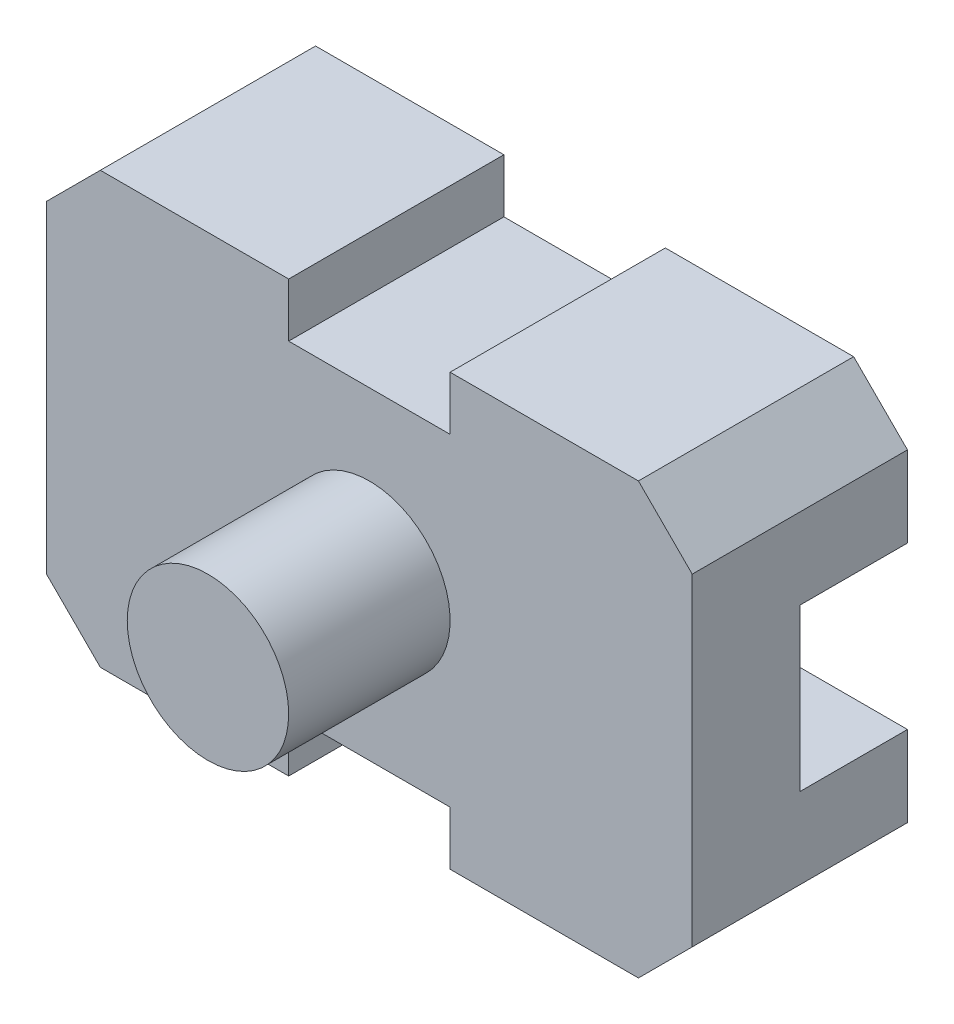
ISO-10303-21;
HEADER;
FILE_DESCRIPTION(('STEP AP214'),'2;1');
FILE_NAME('part.step','',(''),(''),'','','');
FILE_SCHEMA(('AUTOMOTIVE_DESIGN { 1 0 10303 214 1 1 1 1 }'));
ENDSEC;
DATA;
#1=APPLICATION_CONTEXT('core data for automotive mechanical design processes');
#2=APPLICATION_PROTOCOL_DEFINITION('international standard','automotive_design',2000,#1);
#3=PRODUCT_CONTEXT('',#1,'mechanical');
#4=PRODUCT('Part','Part','',(#3));
#5=PRODUCT_RELATED_PRODUCT_CATEGORY('part','',(#4));
#6=PRODUCT_DEFINITION_FORMATION('','',#4);
#7=PRODUCT_DEFINITION_CONTEXT('part definition',#1,'design');
#8=PRODUCT_DEFINITION('design','',#6,#7);
#9=PRODUCT_DEFINITION_SHAPE('','',#8);
#10=(LENGTH_UNIT() NAMED_UNIT(*) SI_UNIT(.MILLI.,.METRE.));
#11=(NAMED_UNIT(*) PLANE_ANGLE_UNIT() SI_UNIT($,.RADIAN.));
#12=(NAMED_UNIT(*) SI_UNIT($,.STERADIAN.) SOLID_ANGLE_UNIT());
#13=UNCERTAINTY_MEASURE_WITH_UNIT(LENGTH_MEASURE(1.E-05),#10,'distance_accuracy_value','');
#14=(GEOMETRIC_REPRESENTATION_CONTEXT(3) GLOBAL_UNCERTAINTY_ASSIGNED_CONTEXT((#13)) GLOBAL_UNIT_ASSIGNED_CONTEXT((#10,
#11,#12)) REPRESENTATION_CONTEXT('',''));
#15=CARTESIAN_POINT('',(0.,0.,0.));
#16=DIRECTION('',(0.,0.,1.));
#17=DIRECTION('',(1.,0.,0.));
#18=AXIS2_PLACEMENT_3D('',#15,#16,#17);
#19=CARTESIAN_POINT('',(0.,0.,0.));
#20=DIRECTION('',(0.,0.,-1.));
#21=DIRECTION('',(-1.,0.,0.));
#22=AXIS2_PLACEMENT_3D('',#19,#20,#21);
#23=PLANE('',#22);
#24=DIRECTION('',(-1.,0.,0.));
#25=VECTOR('',#24,1.);
#26=CARTESIAN_POINT('',(-30.,20.,0.));
#27=LINE('',#26,#25);
#28=CARTESIAN_POINT('',(25.,20.,0.));
#29=VERTEX_POINT('',#28);
#30=CARTESIAN_POINT('',(7.50000000000001,20.,0.));
#31=VERTEX_POINT('',#30);
#32=EDGE_CURVE('E290',#29,#31,#27,.T.);
#33=ORIENTED_EDGE('',*,*,#32,.F.);
#34=DIRECTION('',(-0.707106781186546,0.707106781186549,0.));
#35=VECTOR('',#34,1.);
#36=CARTESIAN_POINT('',(22.5,22.5,0.));
#37=LINE('',#36,#35);
#38=CARTESIAN_POINT('',(30.,15.,0.));
#39=VERTEX_POINT('',#38);
#40=EDGE_CURVE('E319',#29,#39,#37,.F.);
#41=ORIENTED_EDGE('',*,*,#40,.T.);
#42=DIRECTION('',(0.,1.,0.));
#43=VECTOR('',#42,1.);
#44=CARTESIAN_POINT('',(30.,-20.,0.));
#45=LINE('',#44,#43);
#46=CARTESIAN_POINT('',(30.,7.5,0.));
#47=VERTEX_POINT('',#46);
#48=EDGE_CURVE('E195',#47,#39,#45,.T.);
#49=ORIENTED_EDGE('',*,*,#48,.F.);
#50=DIRECTION('',(-1.,0.,0.));
#51=VECTOR('',#50,1.);
#52=CARTESIAN_POINT('',(30.,7.5,0.));
#53=LINE('',#52,#51);
#54=CARTESIAN_POINT('',(-30.,7.5,0.));
#55=VERTEX_POINT('',#54);
#56=EDGE_CURVE('E232',#47,#55,#53,.T.);
#57=ORIENTED_EDGE('',*,*,#56,.T.);
#58=DIRECTION('',(0.,-1.,0.));
#59=VECTOR('',#58,1.);
#60=CARTESIAN_POINT('',(-30.,-20.,0.));
#61=LINE('',#60,#59);
#62=CARTESIAN_POINT('',(-30.,15.,0.));
#63=VERTEX_POINT('',#62);
#64=EDGE_CURVE('E292',#63,#55,#61,.T.);
#65=ORIENTED_EDGE('',*,*,#64,.F.);
#66=DIRECTION('',(-0.707106781186549,-0.707106781186547,0.));
#67=VECTOR('',#66,1.);
#68=CARTESIAN_POINT('',(-22.5,22.5,0.));
#69=LINE('',#68,#67);
#70=CARTESIAN_POINT('',(-25.,20.,0.));
#71=VERTEX_POINT('',#70);
#72=EDGE_CURVE('E60',#63,#71,#69,.F.);
#73=ORIENTED_EDGE('',*,*,#72,.T.);
#74=CARTESIAN_POINT('',(-7.49999999999999,20.,0.));
#75=VERTEX_POINT('',#74);
#76=EDGE_CURVE('E194',#75,#71,#27,.T.);
#77=ORIENTED_EDGE('',*,*,#76,.F.);
#78=DIRECTION('',(0.,1.,0.));
#79=VECTOR('',#78,1.);
#80=CARTESIAN_POINT('',(-7.49999999999999,15.,0.));
#81=LINE('',#80,#79);
#82=CARTESIAN_POINT('',(-7.49999999999999,15.,0.));
#83=VERTEX_POINT('',#82);
#84=EDGE_CURVE('E221',#83,#75,#81,.T.);
#85=ORIENTED_EDGE('',*,*,#84,.F.);
#86=DIRECTION('',(-1.,0.,0.));
#87=VECTOR('',#86,1.);
#88=CARTESIAN_POINT('',(-7.49999999999999,15.,0.));
#89=LINE('',#88,#87);
#90=CARTESIAN_POINT('',(7.50000000000001,15.,0.));
#91=VERTEX_POINT('',#90);
#92=EDGE_CURVE('E224',#91,#83,#89,.T.);
#93=ORIENTED_EDGE('',*,*,#92,.F.);
#94=DIRECTION('',(0.,-1.,0.));
#95=VECTOR('',#94,1.);
#96=CARTESIAN_POINT('',(7.50000000000001,15.,0.));
#97=LINE('',#96,#95);
#98=EDGE_CURVE('E219',#31,#91,#97,.T.);
#99=ORIENTED_EDGE('',*,*,#98,.F.);
#100=EDGE_LOOP('',(#33,#41,#49,#57,#65,#73,#77,#85,#93,#99));
#101=FACE_BOUND('',#100,.T.);
#102=ADVANCED_FACE('F45',(#101),#23,.T.);
#103=CARTESIAN_POINT('',(0.,0.,20.));
#104=DIRECTION('',(0.,0.,-1.));
#105=DIRECTION('',(-1.,0.,0.));
#106=AXIS2_PLACEMENT_3D('',#103,#104,#105);
#107=PLANE('',#106);
#108=CARTESIAN_POINT('',(0.,0.,20.));
#109=DIRECTION('',(0.,0.,-1.));
#110=DIRECTION('',(-1.,0.,0.));
#111=AXIS2_PLACEMENT_3D('',#108,#109,#110);
#112=CIRCLE('',#111,7.5);
#113=CARTESIAN_POINT('',(-7.5,0.,20.));
#114=VERTEX_POINT('',#113);
#115=EDGE_CURVE('E288',#114,#114,#112,.F.);
#116=ORIENTED_EDGE('',*,*,#115,.F.);
#117=EDGE_LOOP('',(#116));
#118=FACE_BOUND('',#117,.T.);
#119=DIRECTION('',(1.,0.,0.));
#120=VECTOR('',#119,1.);
#121=CARTESIAN_POINT('',(-30.,-20.,20.));
#122=LINE('',#121,#120);
#123=CARTESIAN_POINT('',(7.50000000000001,-20.,20.));
#124=VERTEX_POINT('',#123);
#125=CARTESIAN_POINT('',(25.,-20.,20.));
#126=VERTEX_POINT('',#125);
#127=EDGE_CURVE('E286',#124,#126,#122,.T.);
#128=ORIENTED_EDGE('',*,*,#127,.T.);
#129=DIRECTION('',(-0.707106781186549,-0.707106781186547,0.));
#130=VECTOR('',#129,1.);
#131=CARTESIAN_POINT('',(30.,-15.,20.));
#132=LINE('',#131,#130);
#133=CARTESIAN_POINT('',(30.,-15.,20.));
#134=VERTEX_POINT('',#133);
#135=EDGE_CURVE('E313',#126,#134,#132,.F.);
#136=ORIENTED_EDGE('',*,*,#135,.T.);
#137=DIRECTION('',(0.,1.,0.));
#138=VECTOR('',#137,1.);
#139=CARTESIAN_POINT('',(30.,-20.,20.));
#140=LINE('',#139,#138);
#141=CARTESIAN_POINT('',(30.,15.,20.));
#142=VERTEX_POINT('',#141);
#143=EDGE_CURVE('E276',#134,#142,#140,.T.);
#144=ORIENTED_EDGE('',*,*,#143,.T.);
#145=DIRECTION('',(0.707106781186546,-0.707106781186549,0.));
#146=VECTOR('',#145,1.);
#147=CARTESIAN_POINT('',(25.,20.,20.));
#148=LINE('',#147,#146);
#149=CARTESIAN_POINT('',(25.,20.,20.));
#150=VERTEX_POINT('',#149);
#151=EDGE_CURVE('E311',#142,#150,#148,.F.);
#152=ORIENTED_EDGE('',*,*,#151,.T.);
#153=DIRECTION('',(-1.,0.,0.));
#154=VECTOR('',#153,1.);
#155=CARTESIAN_POINT('',(-30.,20.,20.));
#156=LINE('',#155,#154);
#157=CARTESIAN_POINT('',(7.50000000000001,20.,20.));
#158=VERTEX_POINT('',#157);
#159=EDGE_CURVE('E281',#150,#158,#156,.T.);
#160=ORIENTED_EDGE('',*,*,#159,.T.);
#161=DIRECTION('',(0.,-1.,0.));
#162=VECTOR('',#161,1.);
#163=CARTESIAN_POINT('',(7.50000000000001,15.,20.));
#164=LINE('',#163,#162);
#165=CARTESIAN_POINT('',(7.50000000000001,15.,20.));
#166=VERTEX_POINT('',#165);
#167=EDGE_CURVE('E228',#158,#166,#164,.T.);
#168=ORIENTED_EDGE('',*,*,#167,.T.);
#169=DIRECTION('',(-1.,0.,0.));
#170=VECTOR('',#169,1.);
#171=CARTESIAN_POINT('',(-7.49999999999999,15.,20.));
#172=LINE('',#171,#170);
#173=CARTESIAN_POINT('',(-7.49999999999999,15.,20.));
#174=VERTEX_POINT('',#173);
#175=EDGE_CURVE('E222',#166,#174,#172,.T.);
#176=ORIENTED_EDGE('',*,*,#175,.T.);
#177=DIRECTION('',(0.,1.,0.));
#178=VECTOR('',#177,1.);
#179=CARTESIAN_POINT('',(-7.49999999999999,15.,20.));
#180=LINE('',#179,#178);
#181=CARTESIAN_POINT('',(-7.49999999999999,20.,20.));
#182=VERTEX_POINT('',#181);
#183=EDGE_CURVE('E231',#174,#182,#180,.T.);
#184=ORIENTED_EDGE('',*,*,#183,.T.);
#185=CARTESIAN_POINT('',(-25.,20.,20.));
#186=VERTEX_POINT('',#185);
#187=EDGE_CURVE('E279',#182,#186,#156,.T.);
#188=ORIENTED_EDGE('',*,*,#187,.T.);
#189=DIRECTION('',(0.707106781186549,0.707106781186547,0.));
#190=VECTOR('',#189,1.);
#191=CARTESIAN_POINT('',(-30.,15.,20.));
#192=LINE('',#191,#190);
#193=CARTESIAN_POINT('',(-30.,15.,20.));
#194=VERTEX_POINT('',#193);
#195=EDGE_CURVE('E309',#186,#194,#192,.F.);
#196=ORIENTED_EDGE('',*,*,#195,.T.);
#197=DIRECTION('',(0.,-1.,0.));
#198=VECTOR('',#197,1.);
#199=CARTESIAN_POINT('',(-30.,-20.,20.));
#200=LINE('',#199,#198);
#201=CARTESIAN_POINT('',(-30.,-15.,20.));
#202=VERTEX_POINT('',#201);
#203=EDGE_CURVE('E283',#194,#202,#200,.T.);
#204=ORIENTED_EDGE('',*,*,#203,.T.);
#205=DIRECTION('',(-0.707106781186546,0.707106781186549,0.));
#206=VECTOR('',#205,1.);
#207=CARTESIAN_POINT('',(-25.,-20.,20.));
#208=LINE('',#207,#206);
#209=CARTESIAN_POINT('',(-25.,-20.,20.));
#210=VERTEX_POINT('',#209);
#211=EDGE_CURVE('E307',#202,#210,#208,.F.);
#212=ORIENTED_EDGE('',*,*,#211,.T.);
#213=CARTESIAN_POINT('',(-7.49999999999999,-20.,20.));
#214=VERTEX_POINT('',#213);
#215=EDGE_CURVE('E287',#210,#214,#122,.T.);
#216=ORIENTED_EDGE('',*,*,#215,.T.);
#217=DIRECTION('',(0.,-1.,0.));
#218=VECTOR('',#217,1.);
#219=CARTESIAN_POINT('',(-7.49999999999999,-15.,20.));
#220=LINE('',#219,#218);
#221=CARTESIAN_POINT('',(-7.49999999999999,-15.,20.));
#222=VERTEX_POINT('',#221);
#223=EDGE_CURVE('E251',#222,#214,#220,.T.);
#224=ORIENTED_EDGE('',*,*,#223,.F.);
#225=DIRECTION('',(-1.,0.,0.));
#226=VECTOR('',#225,1.);
#227=CARTESIAN_POINT('',(-7.49999999999999,-15.,20.));
#228=LINE('',#227,#226);
#229=CARTESIAN_POINT('',(7.50000000000001,-15.,20.));
#230=VERTEX_POINT('',#229);
#231=EDGE_CURVE('E260',#230,#222,#228,.T.);
#232=ORIENTED_EDGE('',*,*,#231,.F.);
#233=DIRECTION('',(0.,1.,0.));
#234=VECTOR('',#233,1.);
#235=CARTESIAN_POINT('',(7.50000000000001,-15.,20.));
#236=LINE('',#235,#234);
#237=EDGE_CURVE('E240',#124,#230,#236,.T.);
#238=ORIENTED_EDGE('',*,*,#237,.F.);
#239=EDGE_LOOP('',(#128,#136,#144,#152,#160,#168,#176,#184,#188,#196,#204,#212,#216,#224,#232,#238));
#240=FACE_BOUND('',#239,.T.);
#241=ADVANCED_FACE('F332',(#118,#240),#107,.F.);
#242=CARTESIAN_POINT('',(-30.,20.,20.));
#243=DIRECTION('',(0.,-1.,0.));
#244=DIRECTION('',(0.,0.,-1.));
#245=AXIS2_PLACEMENT_3D('',#242,#243,#244);
#246=PLANE('',#245);
#247=ORIENTED_EDGE('',*,*,#159,.F.);
#248=DIRECTION('',(0.,0.,-1.));
#249=VECTOR('',#248,1.);
#250=CARTESIAN_POINT('',(25.,20.,20.));
#251=LINE('',#250,#249);
#252=EDGE_CURVE('E315',#150,#29,#251,.T.);
#253=ORIENTED_EDGE('',*,*,#252,.T.);
#254=ORIENTED_EDGE('',*,*,#32,.T.);
#255=DIRECTION('',(0.,0.,1.));
#256=VECTOR('',#255,1.);
#257=CARTESIAN_POINT('',(7.50000000000001,20.,0.));
#258=LINE('',#257,#256);
#259=EDGE_CURVE('E227',#31,#158,#258,.T.);
#260=ORIENTED_EDGE('',*,*,#259,.T.);
#261=EDGE_LOOP('',(#247,#253,#254,#260));
#262=FACE_BOUND('',#261,.T.);
#263=ADVANCED_FACE('F374',(#262),#246,.F.);
#264=ORIENTED_EDGE('',*,*,#76,.T.);
#265=DIRECTION('',(0.,0.,1.));
#266=VECTOR('',#265,1.);
#267=CARTESIAN_POINT('',(-25.,20.,20.));
#268=LINE('',#267,#266);
#269=EDGE_CURVE('E53',#71,#186,#268,.T.);
#270=ORIENTED_EDGE('',*,*,#269,.T.);
#271=ORIENTED_EDGE('',*,*,#187,.F.);
#272=DIRECTION('',(0.,0.,1.));
#273=VECTOR('',#272,1.);
#274=CARTESIAN_POINT('',(-7.49999999999999,20.,0.));
#275=LINE('',#274,#273);
#276=EDGE_CURVE('E243',#75,#182,#275,.T.);
#277=ORIENTED_EDGE('',*,*,#276,.F.);
#278=EDGE_LOOP('',(#264,#270,#271,#277));
#279=FACE_BOUND('',#278,.T.);
#280=ADVANCED_FACE('F327',(#279),#246,.F.);
#281=CARTESIAN_POINT('',(30.,-15.,0.));
#282=VERTEX_POINT('',#281);
#283=CARTESIAN_POINT('',(30.,-7.5,0.));
#284=VERTEX_POINT('',#283);
#285=EDGE_CURVE('E184',#282,#284,#45,.T.);
#286=ORIENTED_EDGE('',*,*,#285,.F.);
#287=DIRECTION('',(0.707106781186549,0.707106781186547,0.));
#288=VECTOR('',#287,1.);
#289=CARTESIAN_POINT('',(22.5,-22.5,0.));
#290=LINE('',#289,#288);
#291=CARTESIAN_POINT('',(25.,-20.,0.));
#292=VERTEX_POINT('',#291);
#293=EDGE_CURVE('E303',#282,#292,#290,.F.);
#294=ORIENTED_EDGE('',*,*,#293,.T.);
#295=DIRECTION('',(1.,0.,0.));
#296=VECTOR('',#295,1.);
#297=CARTESIAN_POINT('',(-30.,-20.,0.));
#298=LINE('',#297,#296);
#299=CARTESIAN_POINT('',(7.50000000000001,-20.,0.));
#300=VERTEX_POINT('',#299);
#301=EDGE_CURVE('E294',#300,#292,#298,.T.);
#302=ORIENTED_EDGE('',*,*,#301,.F.);
#303=DIRECTION('',(0.,1.,0.));
#304=VECTOR('',#303,1.);
#305=CARTESIAN_POINT('',(7.50000000000001,-15.,0.));
#306=LINE('',#305,#304);
#307=CARTESIAN_POINT('',(7.50000000000001,-15.,0.));
#308=VERTEX_POINT('',#307);
#309=EDGE_CURVE('E247',#300,#308,#306,.T.);
#310=ORIENTED_EDGE('',*,*,#309,.T.);
#311=DIRECTION('',(-1.,0.,0.));
#312=VECTOR('',#311,1.);
#313=CARTESIAN_POINT('',(-7.49999999999999,-15.,0.));
#314=LINE('',#313,#312);
#315=CARTESIAN_POINT('',(-7.49999999999999,-15.,0.));
#316=VERTEX_POINT('',#315);
#317=EDGE_CURVE('E250',#308,#316,#314,.T.);
#318=ORIENTED_EDGE('',*,*,#317,.T.);
#319=DIRECTION('',(0.,-1.,0.));
#320=VECTOR('',#319,1.);
#321=CARTESIAN_POINT('',(-7.49999999999999,-15.,0.));
#322=LINE('',#321,#320);
#323=CARTESIAN_POINT('',(-7.49999999999999,-20.,0.));
#324=VERTEX_POINT('',#323);
#325=EDGE_CURVE('E254',#316,#324,#322,.T.);
#326=ORIENTED_EDGE('',*,*,#325,.T.);
#327=CARTESIAN_POINT('',(-25.,-20.,0.));
#328=VERTEX_POINT('',#327);
#329=EDGE_CURVE('E280',#328,#324,#298,.T.);
#330=ORIENTED_EDGE('',*,*,#329,.F.);
#331=DIRECTION('',(0.707106781186546,-0.707106781186549,0.));
#332=VECTOR('',#331,1.);
#333=CARTESIAN_POINT('',(-22.5,-22.5,0.));
#334=LINE('',#333,#332);
#335=CARTESIAN_POINT('',(-30.,-15.,0.));
#336=VERTEX_POINT('',#335);
#337=EDGE_CURVE('E301',#328,#336,#334,.F.);
#338=ORIENTED_EDGE('',*,*,#337,.T.);
#339=CARTESIAN_POINT('',(-30.,-7.5,0.));
#340=VERTEX_POINT('',#339);
#341=EDGE_CURVE('E210',#340,#336,#61,.T.);
#342=ORIENTED_EDGE('',*,*,#341,.F.);
#343=DIRECTION('',(-1.,0.,0.));
#344=VECTOR('',#343,1.);
#345=CARTESIAN_POINT('',(30.,-7.5,0.));
#346=LINE('',#345,#344);
#347=EDGE_CURVE('E200',#284,#340,#346,.T.);
#348=ORIENTED_EDGE('',*,*,#347,.F.);
#349=EDGE_LOOP('',(#286,#294,#302,#310,#318,#326,#330,#338,#342,#348));
#350=FACE_BOUND('',#349,.T.);
#351=ADVANCED_FACE('F208',(#350),#23,.T.);
#352=CARTESIAN_POINT('',(-30.,-20.,20.));
#353=DIRECTION('',(0.,1.,0.));
#354=DIRECTION('',(0.,0.,1.));
#355=AXIS2_PLACEMENT_3D('',#352,#353,#354);
#356=PLANE('',#355);
#357=ORIENTED_EDGE('',*,*,#301,.T.);
#358=DIRECTION('',(0.,0.,1.));
#359=VECTOR('',#358,1.);
#360=CARTESIAN_POINT('',(25.,-20.,20.));
#361=LINE('',#360,#359);
#362=EDGE_CURVE('E305',#292,#126,#361,.T.);
#363=ORIENTED_EDGE('',*,*,#362,.T.);
#364=ORIENTED_EDGE('',*,*,#127,.F.);
#365=DIRECTION('',(0.,0.,1.));
#366=VECTOR('',#365,1.);
#367=CARTESIAN_POINT('',(7.50000000000001,-20.,0.));
#368=LINE('',#367,#366);
#369=EDGE_CURVE('E265',#300,#124,#368,.T.);
#370=ORIENTED_EDGE('',*,*,#369,.F.);
#371=EDGE_LOOP('',(#357,#363,#364,#370));
#372=FACE_BOUND('',#371,.T.);
#373=ADVANCED_FACE('F379',(#372),#356,.F.);
#374=CARTESIAN_POINT('',(30.,-20.,20.));
#375=DIRECTION('',(-1.,0.,0.));
#376=DIRECTION('',(0.,0.,1.));
#377=AXIS2_PLACEMENT_3D('',#374,#375,#376);
#378=PLANE('',#377);
#379=ORIENTED_EDGE('',*,*,#143,.F.);
#380=DIRECTION('',(0.,0.,-1.));
#381=VECTOR('',#380,1.);
#382=CARTESIAN_POINT('',(30.,-15.,20.));
#383=LINE('',#382,#381);
#384=EDGE_CURVE('E191',#134,#282,#383,.T.);
#385=ORIENTED_EDGE('',*,*,#384,.T.);
#386=ORIENTED_EDGE('',*,*,#285,.T.);
#387=DIRECTION('',(0.,0.,1.));
#388=VECTOR('',#387,1.);
#389=CARTESIAN_POINT('',(30.,-7.5,10.));
#390=LINE('',#389,#388);
#391=CARTESIAN_POINT('',(30.,-7.5,10.));
#392=VERTEX_POINT('',#391);
#393=EDGE_CURVE('E189',#284,#392,#390,.T.);
#394=ORIENTED_EDGE('',*,*,#393,.T.);
#395=DIRECTION('',(0.,1.,0.));
#396=VECTOR('',#395,1.);
#397=CARTESIAN_POINT('',(30.,-7.5,10.));
#398=LINE('',#397,#396);
#399=CARTESIAN_POINT('',(30.,7.5,10.));
#400=VERTEX_POINT('',#399);
#401=EDGE_CURVE('E204',#392,#400,#398,.T.);
#402=ORIENTED_EDGE('',*,*,#401,.T.);
#403=DIRECTION('',(0.,0.,-1.));
#404=VECTOR('',#403,1.);
#405=CARTESIAN_POINT('',(30.,7.5,10.));
#406=LINE('',#405,#404);
#407=EDGE_CURVE('E211',#400,#47,#406,.T.);
#408=ORIENTED_EDGE('',*,*,#407,.T.);
#409=ORIENTED_EDGE('',*,*,#48,.T.);
#410=DIRECTION('',(0.,0.,1.));
#411=VECTOR('',#410,1.);
#412=CARTESIAN_POINT('',(30.,15.,20.));
#413=LINE('',#412,#411);
#414=EDGE_CURVE('E298',#39,#142,#413,.T.);
#415=ORIENTED_EDGE('',*,*,#414,.T.);
#416=EDGE_LOOP('',(#379,#385,#386,#394,#402,#408,#409,#415));
#417=FACE_BOUND('',#416,.T.);
#418=ADVANCED_FACE('F187',(#417),#378,.F.);
#419=CARTESIAN_POINT('',(-30.,-20.,20.));
#420=DIRECTION('',(1.,0.,0.));
#421=DIRECTION('',(0.,0.,-1.));
#422=AXIS2_PLACEMENT_3D('',#419,#420,#421);
#423=PLANE('',#422);
#424=ORIENTED_EDGE('',*,*,#203,.F.);
#425=DIRECTION('',(0.,0.,-1.));
#426=VECTOR('',#425,1.);
#427=CARTESIAN_POINT('',(-30.,15.,20.));
#428=LINE('',#427,#426);
#429=EDGE_CURVE('E323',#194,#63,#428,.T.);
#430=ORIENTED_EDGE('',*,*,#429,.T.);
#431=ORIENTED_EDGE('',*,*,#64,.T.);
#432=DIRECTION('',(0.,0.,-1.));
#433=VECTOR('',#432,1.);
#434=CARTESIAN_POINT('',(-30.,7.5,10.));
#435=LINE('',#434,#433);
#436=CARTESIAN_POINT('',(-30.,7.5,10.));
#437=VERTEX_POINT('',#436);
#438=EDGE_CURVE('E205',#437,#55,#435,.T.);
#439=ORIENTED_EDGE('',*,*,#438,.F.);
#440=DIRECTION('',(0.,1.,0.));
#441=VECTOR('',#440,1.);
#442=CARTESIAN_POINT('',(-30.,-7.5,10.));
#443=LINE('',#442,#441);
#444=CARTESIAN_POINT('',(-30.,-7.5,10.));
#445=VERTEX_POINT('',#444);
#446=EDGE_CURVE('E349',#445,#437,#443,.T.);
#447=ORIENTED_EDGE('',*,*,#446,.F.);
#448=DIRECTION('',(0.,0.,1.));
#449=VECTOR('',#448,1.);
#450=CARTESIAN_POINT('',(-30.,-7.5,10.));
#451=LINE('',#450,#449);
#452=EDGE_CURVE('E352',#340,#445,#451,.T.);
#453=ORIENTED_EDGE('',*,*,#452,.F.);
#454=ORIENTED_EDGE('',*,*,#341,.T.);
#455=DIRECTION('',(0.,0.,1.));
#456=VECTOR('',#455,1.);
#457=CARTESIAN_POINT('',(-30.,-15.,20.));
#458=LINE('',#457,#456);
#459=EDGE_CURVE('E321',#336,#202,#458,.T.);
#460=ORIENTED_EDGE('',*,*,#459,.T.);
#461=EDGE_LOOP('',(#424,#430,#431,#439,#447,#453,#454,#460));
#462=FACE_BOUND('',#461,.T.);
#463=ADVANCED_FACE('F337',(#462),#423,.F.);
#464=ORIENTED_EDGE('',*,*,#215,.F.);
#465=DIRECTION('',(0.,0.,-1.));
#466=VECTOR('',#465,1.);
#467=CARTESIAN_POINT('',(-25.,-20.,20.));
#468=LINE('',#467,#466);
#469=EDGE_CURVE('E13',#210,#328,#468,.T.);
#470=ORIENTED_EDGE('',*,*,#469,.T.);
#471=ORIENTED_EDGE('',*,*,#329,.T.);
#472=DIRECTION('',(0.,0.,1.));
#473=VECTOR('',#472,1.);
#474=CARTESIAN_POINT('',(-7.49999999999999,-20.,0.));
#475=LINE('',#474,#473);
#476=EDGE_CURVE('E268',#324,#214,#475,.T.);
#477=ORIENTED_EDGE('',*,*,#476,.T.);
#478=EDGE_LOOP('',(#464,#470,#471,#477));
#479=FACE_BOUND('',#478,.T.);
#480=ADVANCED_FACE('F385',(#479),#356,.F.);
#481=CARTESIAN_POINT('',(0.,0.,35.));
#482=DIRECTION('',(0.,0.,-1.));
#483=DIRECTION('',(-1.,0.,0.));
#484=AXIS2_PLACEMENT_3D('',#481,#482,#483);
#485=CYLINDRICAL_SURFACE('',#484,7.5);
#486=CARTESIAN_POINT('',(0.,0.,35.));
#487=DIRECTION('',(0.,0.,1.));
#488=DIRECTION('',(1.,0.,0.));
#489=AXIS2_PLACEMENT_3D('',#486,#487,#488);
#490=CIRCLE('',#489,7.5);
#491=CARTESIAN_POINT('',(7.5,0.,35.));
#492=VERTEX_POINT('',#491);
#493=EDGE_CURVE('E267',#492,#492,#490,.T.);
#494=ORIENTED_EDGE('',*,*,#493,.F.);
#495=EDGE_LOOP('',(#494));
#496=FACE_BOUND('',#495,.T.);
#497=ORIENTED_EDGE('',*,*,#115,.T.);
#498=EDGE_LOOP('',(#497));
#499=FACE_BOUND('',#498,.T.);
#500=ADVANCED_FACE('F463',(#496,#499),#485,.T.);
#501=CARTESIAN_POINT('',(0.,0.,35.));
#502=DIRECTION('',(0.,0.,1.));
#503=DIRECTION('',(1.,0.,0.));
#504=AXIS2_PLACEMENT_3D('',#501,#502,#503);
#505=PLANE('',#504);
#506=ORIENTED_EDGE('',*,*,#493,.T.);
#507=EDGE_LOOP('',(#506));
#508=FACE_BOUND('',#507,.T.);
#509=ADVANCED_FACE('F460',(#508),#505,.T.);
#510=CARTESIAN_POINT('',(7.50000000000001,-15.,0.));
#511=DIRECTION('',(1.,0.,0.));
#512=DIRECTION('',(0.,0.,-1.));
#513=AXIS2_PLACEMENT_3D('',#510,#511,#512);
#514=PLANE('',#513);
#515=ORIENTED_EDGE('',*,*,#237,.T.);
#516=DIRECTION('',(0.,0.,1.));
#517=VECTOR('',#516,1.);
#518=CARTESIAN_POINT('',(7.50000000000001,-15.,0.));
#519=LINE('',#518,#517);
#520=EDGE_CURVE('E257',#308,#230,#519,.T.);
#521=ORIENTED_EDGE('',*,*,#520,.F.);
#522=ORIENTED_EDGE('',*,*,#309,.F.);
#523=ORIENTED_EDGE('',*,*,#369,.T.);
#524=EDGE_LOOP('',(#515,#521,#522,#523));
#525=FACE_BOUND('',#524,.T.);
#526=ADVANCED_FACE('F455',(#525),#514,.F.);
#527=CARTESIAN_POINT('',(-7.49999999999999,-15.,0.));
#528=DIRECTION('',(-1.,0.,0.));
#529=DIRECTION('',(0.,-1.,0.));
#530=AXIS2_PLACEMENT_3D('',#527,#528,#529);
#531=PLANE('',#530);
#532=ORIENTED_EDGE('',*,*,#223,.T.);
#533=ORIENTED_EDGE('',*,*,#476,.F.);
#534=ORIENTED_EDGE('',*,*,#325,.F.);
#535=DIRECTION('',(0.,0.,1.));
#536=VECTOR('',#535,1.);
#537=CARTESIAN_POINT('',(-7.49999999999999,-15.,0.));
#538=LINE('',#537,#536);
#539=EDGE_CURVE('E271',#316,#222,#538,.T.);
#540=ORIENTED_EDGE('',*,*,#539,.T.);
#541=EDGE_LOOP('',(#532,#533,#534,#540));
#542=FACE_BOUND('',#541,.T.);
#543=ADVANCED_FACE('F418',(#542),#531,.F.);
#544=CARTESIAN_POINT('',(-7.49999999999999,-15.,0.));
#545=DIRECTION('',(0.,1.,0.));
#546=DIRECTION('',(0.,0.,1.));
#547=AXIS2_PLACEMENT_3D('',#544,#545,#546);
#548=PLANE('',#547);
#549=ORIENTED_EDGE('',*,*,#231,.T.);
#550=ORIENTED_EDGE('',*,*,#539,.F.);
#551=ORIENTED_EDGE('',*,*,#317,.F.);
#552=ORIENTED_EDGE('',*,*,#520,.T.);
#553=EDGE_LOOP('',(#549,#550,#551,#552));
#554=FACE_BOUND('',#553,.T.);
#555=ADVANCED_FACE('F423',(#554),#548,.F.);
#556=CARTESIAN_POINT('',(7.50000000000001,15.,0.));
#557=DIRECTION('',(-1.,0.,0.));
#558=DIRECTION('',(0.,0.,1.));
#559=AXIS2_PLACEMENT_3D('',#556,#557,#558);
#560=PLANE('',#559);
#561=ORIENTED_EDGE('',*,*,#167,.F.);
#562=ORIENTED_EDGE('',*,*,#259,.F.);
#563=ORIENTED_EDGE('',*,*,#98,.T.);
#564=DIRECTION('',(0.,0.,1.));
#565=VECTOR('',#564,1.);
#566=CARTESIAN_POINT('',(7.50000000000001,15.,0.));
#567=LINE('',#566,#565);
#568=EDGE_CURVE('E237',#91,#166,#567,.T.);
#569=ORIENTED_EDGE('',*,*,#568,.T.);
#570=EDGE_LOOP('',(#561,#562,#563,#569));
#571=FACE_BOUND('',#570,.T.);
#572=ADVANCED_FACE('F440',(#571),#560,.T.);
#573=CARTESIAN_POINT('',(-7.49999999999999,15.,0.));
#574=DIRECTION('',(0.,1.,0.));
#575=DIRECTION('',(0.,0.,1.));
#576=AXIS2_PLACEMENT_3D('',#573,#574,#575);
#577=PLANE('',#576);
#578=ORIENTED_EDGE('',*,*,#175,.F.);
#579=ORIENTED_EDGE('',*,*,#568,.F.);
#580=ORIENTED_EDGE('',*,*,#92,.T.);
#581=DIRECTION('',(0.,0.,1.));
#582=VECTOR('',#581,1.);
#583=CARTESIAN_POINT('',(-7.49999999999999,15.,0.));
#584=LINE('',#583,#582);
#585=EDGE_CURVE('E241',#83,#174,#584,.T.);
#586=ORIENTED_EDGE('',*,*,#585,.T.);
#587=EDGE_LOOP('',(#578,#579,#580,#586));
#588=FACE_BOUND('',#587,.T.);
#589=ADVANCED_FACE('F366',(#588),#577,.T.);
#590=CARTESIAN_POINT('',(-7.49999999999999,15.,0.));
#591=DIRECTION('',(1.,0.,0.));
#592=DIRECTION('',(0.,1.,0.));
#593=AXIS2_PLACEMENT_3D('',#590,#591,#592);
#594=PLANE('',#593);
#595=ORIENTED_EDGE('',*,*,#183,.F.);
#596=ORIENTED_EDGE('',*,*,#585,.F.);
#597=ORIENTED_EDGE('',*,*,#84,.T.);
#598=ORIENTED_EDGE('',*,*,#276,.T.);
#599=EDGE_LOOP('',(#595,#596,#597,#598));
#600=FACE_BOUND('',#599,.T.);
#601=ADVANCED_FACE('F359',(#600),#594,.T.);
#602=CARTESIAN_POINT('',(30.,7.5,10.));
#603=DIRECTION('',(0.,1.,0.));
#604=DIRECTION('',(0.,0.,1.));
#605=AXIS2_PLACEMENT_3D('',#602,#603,#604);
#606=PLANE('',#605);
#607=ORIENTED_EDGE('',*,*,#438,.T.);
#608=ORIENTED_EDGE('',*,*,#56,.F.);
#609=ORIENTED_EDGE('',*,*,#407,.F.);
#610=DIRECTION('',(-1.,0.,0.));
#611=VECTOR('',#610,1.);
#612=CARTESIAN_POINT('',(30.,7.5,10.));
#613=LINE('',#612,#611);
#614=EDGE_CURVE('E213',#400,#437,#613,.T.);
#615=ORIENTED_EDGE('',*,*,#614,.T.);
#616=EDGE_LOOP('',(#607,#608,#609,#615));
#617=FACE_BOUND('',#616,.T.);
#618=ADVANCED_FACE('F357',(#617),#606,.F.);
#619=CARTESIAN_POINT('',(30.,-7.5,10.));
#620=DIRECTION('',(0.,0.,1.));
#621=DIRECTION('',(1.,0.,0.));
#622=AXIS2_PLACEMENT_3D('',#619,#620,#621);
#623=PLANE('',#622);
#624=ORIENTED_EDGE('',*,*,#446,.T.);
#625=ORIENTED_EDGE('',*,*,#614,.F.);
#626=ORIENTED_EDGE('',*,*,#401,.F.);
#627=DIRECTION('',(-1.,0.,0.));
#628=VECTOR('',#627,1.);
#629=CARTESIAN_POINT('',(30.,-7.5,10.));
#630=LINE('',#629,#628);
#631=EDGE_CURVE('E202',#392,#445,#630,.T.);
#632=ORIENTED_EDGE('',*,*,#631,.T.);
#633=EDGE_LOOP('',(#624,#625,#626,#632));
#634=FACE_BOUND('',#633,.T.);
#635=ADVANCED_FACE('F355',(#634),#623,.F.);
#636=CARTESIAN_POINT('',(30.,-7.5,10.));
#637=DIRECTION('',(0.,-1.,0.));
#638=DIRECTION('',(0.,0.,-1.));
#639=AXIS2_PLACEMENT_3D('',#636,#637,#638);
#640=PLANE('',#639);
#641=ORIENTED_EDGE('',*,*,#452,.T.);
#642=ORIENTED_EDGE('',*,*,#631,.F.);
#643=ORIENTED_EDGE('',*,*,#393,.F.);
#644=ORIENTED_EDGE('',*,*,#347,.T.);
#645=EDGE_LOOP('',(#641,#642,#643,#644));
#646=FACE_BOUND('',#645,.T.);
#647=ADVANCED_FACE('F199',(#646),#640,.F.);
#648=CARTESIAN_POINT('',(30.,-15.,20.));
#649=DIRECTION('',(-0.707106781186546,0.707106781186548,0.));
#650=DIRECTION('',(0.,0.,-1.));
#651=AXIS2_PLACEMENT_3D('',#648,#649,#650);
#652=PLANE('',#651);
#653=ORIENTED_EDGE('',*,*,#135,.F.);
#654=ORIENTED_EDGE('',*,*,#362,.F.);
#655=ORIENTED_EDGE('',*,*,#293,.F.);
#656=ORIENTED_EDGE('',*,*,#384,.F.);
#657=EDGE_LOOP('',(#653,#654,#655,#656));
#658=FACE_BOUND('',#657,.T.);
#659=ADVANCED_FACE('F395',(#658),#652,.F.);
#660=CARTESIAN_POINT('',(25.,20.,20.));
#661=DIRECTION('',(-0.707106781186549,-0.707106781186546,0.));
#662=DIRECTION('',(0.,0.,-1.));
#663=AXIS2_PLACEMENT_3D('',#660,#661,#662);
#664=PLANE('',#663);
#665=ORIENTED_EDGE('',*,*,#151,.F.);
#666=ORIENTED_EDGE('',*,*,#414,.F.);
#667=ORIENTED_EDGE('',*,*,#40,.F.);
#668=ORIENTED_EDGE('',*,*,#252,.F.);
#669=EDGE_LOOP('',(#665,#666,#667,#668));
#670=FACE_BOUND('',#669,.T.);
#671=ADVANCED_FACE('F398',(#670),#664,.F.);
#672=CARTESIAN_POINT('',(-30.,15.,20.));
#673=DIRECTION('',(0.707106781186546,-0.707106781186548,0.));
#674=DIRECTION('',(0.,0.,-1.));
#675=AXIS2_PLACEMENT_3D('',#672,#673,#674);
#676=PLANE('',#675);
#677=ORIENTED_EDGE('',*,*,#195,.F.);
#678=ORIENTED_EDGE('',*,*,#269,.F.);
#679=ORIENTED_EDGE('',*,*,#72,.F.);
#680=ORIENTED_EDGE('',*,*,#429,.F.);
#681=EDGE_LOOP('',(#677,#678,#679,#680));
#682=FACE_BOUND('',#681,.T.);
#683=ADVANCED_FACE('F335',(#682),#676,.F.);
#684=CARTESIAN_POINT('',(-25.,-20.,20.));
#685=DIRECTION('',(0.707106781186549,0.707106781186546,0.));
#686=DIRECTION('',(0.,0.,-1.));
#687=AXIS2_PLACEMENT_3D('',#684,#685,#686);
#688=PLANE('',#687);
#689=ORIENTED_EDGE('',*,*,#211,.F.);
#690=ORIENTED_EDGE('',*,*,#459,.F.);
#691=ORIENTED_EDGE('',*,*,#337,.F.);
#692=ORIENTED_EDGE('',*,*,#469,.F.);
#693=EDGE_LOOP('',(#689,#690,#691,#692));
#694=FACE_BOUND('',#693,.T.);
#695=ADVANCED_FACE('F47',(#694),#688,.F.);
#696=CLOSED_SHELL('',(#102,#241,#263,#280,#351,#373,#418,#463,#480,#500,#509,#526,#543,#555,
#572,#589,#601,#618,#635,#647,#659,#671,#683,#695));
#697=MANIFOLD_SOLID_BREP('B2',#696);
#698=ADVANCED_BREP_SHAPE_REPRESENTATION('',(#18,#697),#14);
#699=SHAPE_DEFINITION_REPRESENTATION(#9,#698);
ENDSEC;
END-ISO-10303-21;
